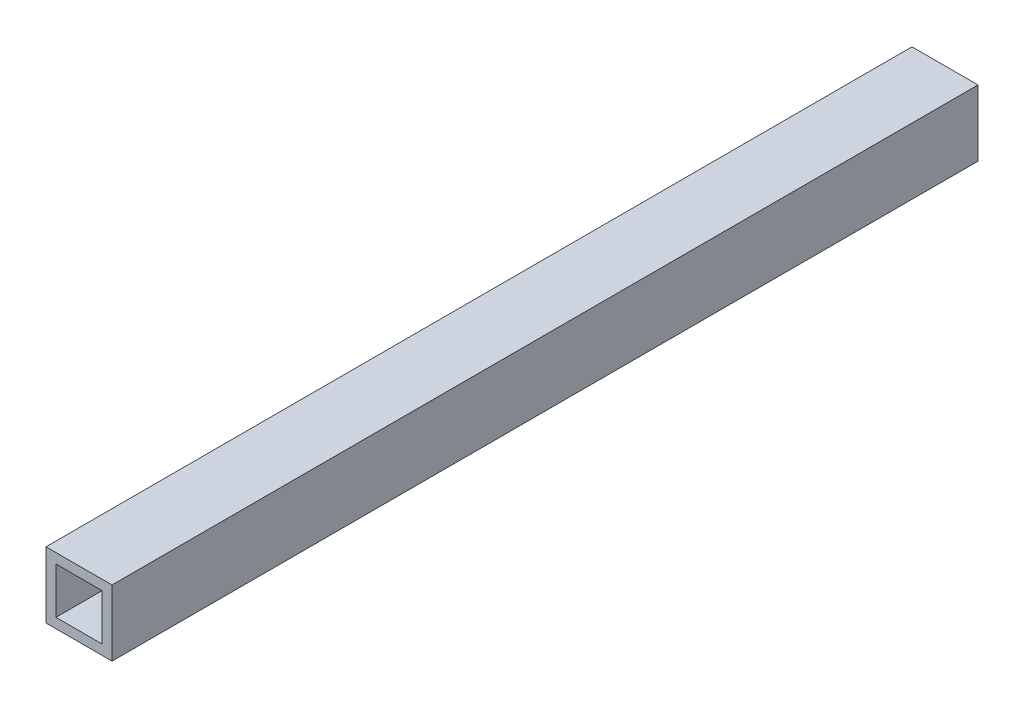
ISO-10303-21;
HEADER;
FILE_DESCRIPTION(('STEP AP214'),'2;1');
FILE_NAME('part.step','',(''),(''),'','','');
FILE_SCHEMA(('AUTOMOTIVE_DESIGN { 1 0 10303 214 1 1 1 1 }'));
ENDSEC;
DATA;
#1=APPLICATION_CONTEXT('core data for automotive mechanical design processes');
#2=APPLICATION_PROTOCOL_DEFINITION('international standard','automotive_design',2000,#1);
#3=PRODUCT_CONTEXT('',#1,'mechanical');
#4=PRODUCT('Part','Part','',(#3));
#5=PRODUCT_RELATED_PRODUCT_CATEGORY('part','',(#4));
#6=PRODUCT_DEFINITION_FORMATION('','',#4);
#7=PRODUCT_DEFINITION_CONTEXT('part definition',#1,'design');
#8=PRODUCT_DEFINITION('design','',#6,#7);
#9=PRODUCT_DEFINITION_SHAPE('','',#8);
#10=(LENGTH_UNIT() NAMED_UNIT(*) SI_UNIT(.MILLI.,.METRE.));
#11=(NAMED_UNIT(*) PLANE_ANGLE_UNIT() SI_UNIT($,.RADIAN.));
#12=(NAMED_UNIT(*) SI_UNIT($,.STERADIAN.) SOLID_ANGLE_UNIT());
#13=UNCERTAINTY_MEASURE_WITH_UNIT(LENGTH_MEASURE(1.E-05),#10,'distance_accuracy_value','');
#14=(GEOMETRIC_REPRESENTATION_CONTEXT(3) GLOBAL_UNCERTAINTY_ASSIGNED_CONTEXT((#13)) GLOBAL_UNIT_ASSIGNED_CONTEXT((#10,
#11,#12)) REPRESENTATION_CONTEXT('',''));
#15=CARTESIAN_POINT('',(0.,0.,0.));
#16=DIRECTION('',(0.,0.,1.));
#17=DIRECTION('',(1.,0.,0.));
#18=AXIS2_PLACEMENT_3D('',#15,#16,#17);
#19=CARTESIAN_POINT('',(0.,0.,131.16));
#20=DIRECTION('',(0.,0.,1.));
#21=DIRECTION('',(1.,0.,0.));
#22=AXIS2_PLACEMENT_3D('',#19,#20,#21);
#23=PLANE('',#22);
#24=DIRECTION('',(0.,1.,0.));
#25=VECTOR('',#24,1.);
#26=CARTESIAN_POINT('',(5.,5.,131.16));
#27=LINE('',#26,#25);
#28=CARTESIAN_POINT('',(5.,-5.,131.16));
#29=VERTEX_POINT('',#28);
#30=CARTESIAN_POINT('',(5.,5.,131.16));
#31=VERTEX_POINT('',#30);
#32=EDGE_CURVE('E134',#29,#31,#27,.T.);
#33=ORIENTED_EDGE('',*,*,#32,.T.);
#34=DIRECTION('',(-1.,0.,0.));
#35=VECTOR('',#34,1.);
#36=CARTESIAN_POINT('',(-5.,5.,131.16));
#37=LINE('',#36,#35);
#38=CARTESIAN_POINT('',(-5.,5.,131.16));
#39=VERTEX_POINT('',#38);
#40=EDGE_CURVE('E137',#31,#39,#37,.T.);
#41=ORIENTED_EDGE('',*,*,#40,.T.);
#42=DIRECTION('',(0.,-1.,0.));
#43=VECTOR('',#42,1.);
#44=CARTESIAN_POINT('',(-5.,5.,131.16));
#45=LINE('',#44,#43);
#46=CARTESIAN_POINT('',(-5.,-5.,131.16));
#47=VERTEX_POINT('',#46);
#48=EDGE_CURVE('E140',#39,#47,#45,.T.);
#49=ORIENTED_EDGE('',*,*,#48,.T.);
#50=DIRECTION('',(1.,0.,0.));
#51=VECTOR('',#50,1.);
#52=CARTESIAN_POINT('',(-5.,-5.,131.16));
#53=LINE('',#52,#51);
#54=EDGE_CURVE('E142',#47,#29,#53,.T.);
#55=ORIENTED_EDGE('',*,*,#54,.T.);
#56=EDGE_LOOP('',(#33,#41,#49,#55));
#57=FACE_BOUND('',#56,.T.);
#58=DIRECTION('',(-1.,0.,0.));
#59=VECTOR('',#58,1.);
#60=CARTESIAN_POINT('',(-3.5,3.5,131.16));
#61=LINE('',#60,#59);
#62=CARTESIAN_POINT('',(3.5,3.5,131.16));
#63=VERTEX_POINT('',#62);
#64=CARTESIAN_POINT('',(-3.5,3.5,131.16));
#65=VERTEX_POINT('',#64);
#66=EDGE_CURVE('E106',#63,#65,#61,.T.);
#67=ORIENTED_EDGE('',*,*,#66,.F.);
#68=DIRECTION('',(0.,1.,0.));
#69=VECTOR('',#68,1.);
#70=CARTESIAN_POINT('',(3.5,-3.5,131.16));
#71=LINE('',#70,#69);
#72=CARTESIAN_POINT('',(3.5,-3.5,131.16));
#73=VERTEX_POINT('',#72);
#74=EDGE_CURVE('E98',#73,#63,#71,.T.);
#75=ORIENTED_EDGE('',*,*,#74,.F.);
#76=DIRECTION('',(1.,0.,0.));
#77=VECTOR('',#76,1.);
#78=CARTESIAN_POINT('',(-3.5,-3.5,131.16));
#79=LINE('',#78,#77);
#80=CARTESIAN_POINT('',(-3.5,-3.5,131.16));
#81=VERTEX_POINT('',#80);
#82=EDGE_CURVE('E120',#81,#73,#79,.T.);
#83=ORIENTED_EDGE('',*,*,#82,.F.);
#84=DIRECTION('',(0.,-1.,0.));
#85=VECTOR('',#84,1.);
#86=CARTESIAN_POINT('',(-3.5,-3.5,131.16));
#87=LINE('',#86,#85);
#88=EDGE_CURVE('E118',#65,#81,#87,.T.);
#89=ORIENTED_EDGE('',*,*,#88,.F.);
#90=EDGE_LOOP('',(#67,#75,#83,#89));
#91=FACE_BOUND('',#90,.T.);
#92=ADVANCED_FACE('F33',(#57,#91),#23,.T.);
#93=CARTESIAN_POINT('',(0.,0.,0.));
#94=DIRECTION('',(0.,0.,1.));
#95=DIRECTION('',(1.,0.,0.));
#96=AXIS2_PLACEMENT_3D('',#93,#94,#95);
#97=PLANE('',#96);
#98=DIRECTION('',(0.,1.,0.));
#99=VECTOR('',#98,1.);
#100=CARTESIAN_POINT('',(5.,5.,0.));
#101=LINE('',#100,#99);
#102=CARTESIAN_POINT('',(5.,-5.,0.));
#103=VERTEX_POINT('',#102);
#104=CARTESIAN_POINT('',(5.,5.,0.));
#105=VERTEX_POINT('',#104);
#106=EDGE_CURVE('E114',#103,#105,#101,.T.);
#107=ORIENTED_EDGE('',*,*,#106,.F.);
#108=DIRECTION('',(1.,0.,0.));
#109=VECTOR('',#108,1.);
#110=CARTESIAN_POINT('',(-5.,-5.,0.));
#111=LINE('',#110,#109);
#112=CARTESIAN_POINT('',(-5.,-5.,0.));
#113=VERTEX_POINT('',#112);
#114=EDGE_CURVE('E138',#113,#103,#111,.T.);
#115=ORIENTED_EDGE('',*,*,#114,.F.);
#116=DIRECTION('',(0.,-1.,0.));
#117=VECTOR('',#116,1.);
#118=CARTESIAN_POINT('',(-5.,5.,0.));
#119=LINE('',#118,#117);
#120=CARTESIAN_POINT('',(-5.,5.,0.));
#121=VERTEX_POINT('',#120);
#122=EDGE_CURVE('E149',#121,#113,#119,.T.);
#123=ORIENTED_EDGE('',*,*,#122,.F.);
#124=DIRECTION('',(-1.,0.,0.));
#125=VECTOR('',#124,1.);
#126=CARTESIAN_POINT('',(-5.,5.,0.));
#127=LINE('',#126,#125);
#128=EDGE_CURVE('E147',#105,#121,#127,.T.);
#129=ORIENTED_EDGE('',*,*,#128,.F.);
#130=EDGE_LOOP('',(#107,#115,#123,#129));
#131=FACE_BOUND('',#130,.T.);
#132=DIRECTION('',(0.,1.,0.));
#133=VECTOR('',#132,1.);
#134=CARTESIAN_POINT('',(3.5,-3.5,0.));
#135=LINE('',#134,#133);
#136=CARTESIAN_POINT('',(3.5,-3.5,0.));
#137=VERTEX_POINT('',#136);
#138=CARTESIAN_POINT('',(3.5,3.5,0.));
#139=VERTEX_POINT('',#138);
#140=EDGE_CURVE('E56',#137,#139,#135,.T.);
#141=ORIENTED_EDGE('',*,*,#140,.T.);
#142=DIRECTION('',(-1.,0.,0.));
#143=VECTOR('',#142,1.);
#144=CARTESIAN_POINT('',(-3.5,3.5,0.));
#145=LINE('',#144,#143);
#146=CARTESIAN_POINT('',(-3.5,3.5,0.));
#147=VERTEX_POINT('',#146);
#148=EDGE_CURVE('E113',#139,#147,#145,.T.);
#149=ORIENTED_EDGE('',*,*,#148,.T.);
#150=DIRECTION('',(0.,-1.,0.));
#151=VECTOR('',#150,1.);
#152=CARTESIAN_POINT('',(-3.5,-3.5,0.));
#153=LINE('',#152,#151);
#154=CARTESIAN_POINT('',(-3.5,-3.5,0.));
#155=VERTEX_POINT('',#154);
#156=EDGE_CURVE('E126',#147,#155,#153,.T.);
#157=ORIENTED_EDGE('',*,*,#156,.T.);
#158=DIRECTION('',(1.,0.,0.));
#159=VECTOR('',#158,1.);
#160=CARTESIAN_POINT('',(-3.5,-3.5,0.));
#161=LINE('',#160,#159);
#162=EDGE_CURVE('E107',#155,#137,#161,.T.);
#163=ORIENTED_EDGE('',*,*,#162,.T.);
#164=EDGE_LOOP('',(#141,#149,#157,#163));
#165=FACE_BOUND('',#164,.T.);
#166=ADVANCED_FACE('F167',(#131,#165),#97,.F.);
#167=CARTESIAN_POINT('',(5.,5.,131.16));
#168=DIRECTION('',(-1.,0.,0.));
#169=DIRECTION('',(0.,-1.,0.));
#170=AXIS2_PLACEMENT_3D('',#167,#168,#169);
#171=PLANE('',#170);
#172=ORIENTED_EDGE('',*,*,#106,.T.);
#173=DIRECTION('',(0.,0.,-1.));
#174=VECTOR('',#173,1.);
#175=CARTESIAN_POINT('',(5.,5.,131.16));
#176=LINE('',#175,#174);
#177=EDGE_CURVE('E11',#31,#105,#176,.T.);
#178=ORIENTED_EDGE('',*,*,#177,.F.);
#179=ORIENTED_EDGE('',*,*,#32,.F.);
#180=DIRECTION('',(0.,0.,-1.));
#181=VECTOR('',#180,1.);
#182=CARTESIAN_POINT('',(5.,-5.,131.16));
#183=LINE('',#182,#181);
#184=EDGE_CURVE('E144',#29,#103,#183,.T.);
#185=ORIENTED_EDGE('',*,*,#184,.T.);
#186=EDGE_LOOP('',(#172,#178,#179,#185));
#187=FACE_BOUND('',#186,.T.);
#188=ADVANCED_FACE('F35',(#187),#171,.F.);
#189=CARTESIAN_POINT('',(-5.,5.,131.16));
#190=DIRECTION('',(0.,-1.,0.));
#191=DIRECTION('',(0.,0.,-1.));
#192=AXIS2_PLACEMENT_3D('',#189,#190,#191);
#193=PLANE('',#192);
#194=ORIENTED_EDGE('',*,*,#128,.T.);
#195=DIRECTION('',(0.,0.,-1.));
#196=VECTOR('',#195,1.);
#197=CARTESIAN_POINT('',(-5.,5.,131.16));
#198=LINE('',#197,#196);
#199=EDGE_CURVE('E41',#39,#121,#198,.T.);
#200=ORIENTED_EDGE('',*,*,#199,.F.);
#201=ORIENTED_EDGE('',*,*,#40,.F.);
#202=ORIENTED_EDGE('',*,*,#177,.T.);
#203=EDGE_LOOP('',(#194,#200,#201,#202));
#204=FACE_BOUND('',#203,.T.);
#205=ADVANCED_FACE('F177',(#204),#193,.F.);
#206=CARTESIAN_POINT('',(-5.,5.,131.16));
#207=DIRECTION('',(1.,0.,0.));
#208=DIRECTION('',(0.,1.,0.));
#209=AXIS2_PLACEMENT_3D('',#206,#207,#208);
#210=PLANE('',#209);
#211=ORIENTED_EDGE('',*,*,#122,.T.);
#212=DIRECTION('',(0.,0.,-1.));
#213=VECTOR('',#212,1.);
#214=CARTESIAN_POINT('',(-5.,-5.,131.16));
#215=LINE('',#214,#213);
#216=EDGE_CURVE('E154',#47,#113,#215,.T.);
#217=ORIENTED_EDGE('',*,*,#216,.F.);
#218=ORIENTED_EDGE('',*,*,#48,.F.);
#219=ORIENTED_EDGE('',*,*,#199,.T.);
#220=EDGE_LOOP('',(#211,#217,#218,#219));
#221=FACE_BOUND('',#220,.T.);
#222=ADVANCED_FACE('F161',(#221),#210,.F.);
#223=CARTESIAN_POINT('',(-5.,-5.,131.16));
#224=DIRECTION('',(0.,1.,0.));
#225=DIRECTION('',(0.,0.,1.));
#226=AXIS2_PLACEMENT_3D('',#223,#224,#225);
#227=PLANE('',#226);
#228=ORIENTED_EDGE('',*,*,#114,.T.);
#229=ORIENTED_EDGE('',*,*,#184,.F.);
#230=ORIENTED_EDGE('',*,*,#54,.F.);
#231=ORIENTED_EDGE('',*,*,#216,.T.);
#232=EDGE_LOOP('',(#228,#229,#230,#231));
#233=FACE_BOUND('',#232,.T.);
#234=ADVANCED_FACE('F171',(#233),#227,.F.);
#235=CARTESIAN_POINT('',(3.5,-3.5,131.16));
#236=DIRECTION('',(-1.,0.,0.));
#237=DIRECTION('',(0.,0.,1.));
#238=AXIS2_PLACEMENT_3D('',#235,#236,#237);
#239=PLANE('',#238);
#240=ORIENTED_EDGE('',*,*,#140,.F.);
#241=DIRECTION('',(0.,0.,-1.));
#242=VECTOR('',#241,1.);
#243=CARTESIAN_POINT('',(3.5,-3.5,131.16));
#244=LINE('',#243,#242);
#245=EDGE_CURVE('E102',#73,#137,#244,.T.);
#246=ORIENTED_EDGE('',*,*,#245,.F.);
#247=ORIENTED_EDGE('',*,*,#74,.T.);
#248=DIRECTION('',(0.,0.,-1.));
#249=VECTOR('',#248,1.);
#250=CARTESIAN_POINT('',(3.5,3.5,131.16));
#251=LINE('',#250,#249);
#252=EDGE_CURVE('E101',#63,#139,#251,.T.);
#253=ORIENTED_EDGE('',*,*,#252,.T.);
#254=EDGE_LOOP('',(#240,#246,#247,#253));
#255=FACE_BOUND('',#254,.T.);
#256=ADVANCED_FACE('F100',(#255),#239,.T.);
#257=CARTESIAN_POINT('',(-3.5,3.5,131.16));
#258=DIRECTION('',(0.,-1.,0.));
#259=DIRECTION('',(0.,0.,-1.));
#260=AXIS2_PLACEMENT_3D('',#257,#258,#259);
#261=PLANE('',#260);
#262=ORIENTED_EDGE('',*,*,#148,.F.);
#263=ORIENTED_EDGE('',*,*,#252,.F.);
#264=ORIENTED_EDGE('',*,*,#66,.T.);
#265=DIRECTION('',(0.,0.,-1.));
#266=VECTOR('',#265,1.);
#267=CARTESIAN_POINT('',(-3.5,3.5,131.16));
#268=LINE('',#267,#266);
#269=EDGE_CURVE('E115',#65,#147,#268,.T.);
#270=ORIENTED_EDGE('',*,*,#269,.T.);
#271=EDGE_LOOP('',(#262,#263,#264,#270));
#272=FACE_BOUND('',#271,.T.);
#273=ADVANCED_FACE('F110',(#272),#261,.T.);
#274=CARTESIAN_POINT('',(-3.5,-3.5,131.16));
#275=DIRECTION('',(1.,0.,0.));
#276=DIRECTION('',(0.,0.,-1.));
#277=AXIS2_PLACEMENT_3D('',#274,#275,#276);
#278=PLANE('',#277);
#279=ORIENTED_EDGE('',*,*,#156,.F.);
#280=ORIENTED_EDGE('',*,*,#269,.F.);
#281=ORIENTED_EDGE('',*,*,#88,.T.);
#282=DIRECTION('',(0.,0.,-1.));
#283=VECTOR('',#282,1.);
#284=CARTESIAN_POINT('',(-3.5,-3.5,131.16));
#285=LINE('',#284,#283);
#286=EDGE_CURVE('E48',#81,#155,#285,.T.);
#287=ORIENTED_EDGE('',*,*,#286,.T.);
#288=EDGE_LOOP('',(#279,#280,#281,#287));
#289=FACE_BOUND('',#288,.T.);
#290=ADVANCED_FACE('F200',(#289),#278,.T.);
#291=CARTESIAN_POINT('',(-3.5,-3.5,131.16));
#292=DIRECTION('',(0.,1.,0.));
#293=DIRECTION('',(0.,0.,1.));
#294=AXIS2_PLACEMENT_3D('',#291,#292,#293);
#295=PLANE('',#294);
#296=ORIENTED_EDGE('',*,*,#162,.F.);
#297=ORIENTED_EDGE('',*,*,#286,.F.);
#298=ORIENTED_EDGE('',*,*,#82,.T.);
#299=ORIENTED_EDGE('',*,*,#245,.T.);
#300=EDGE_LOOP('',(#296,#297,#298,#299));
#301=FACE_BOUND('',#300,.T.);
#302=ADVANCED_FACE('F204',(#301),#295,.T.);
#303=CLOSED_SHELL('',(#92,#166,#188,#205,#222,#234,#256,#273,#290,#302));
#304=MANIFOLD_SOLID_BREP('B2',#303);
#305=ADVANCED_BREP_SHAPE_REPRESENTATION('',(#18,#304),#14);
#306=SHAPE_DEFINITION_REPRESENTATION(#9,#305);
ENDSEC;
END-ISO-10303-21;
